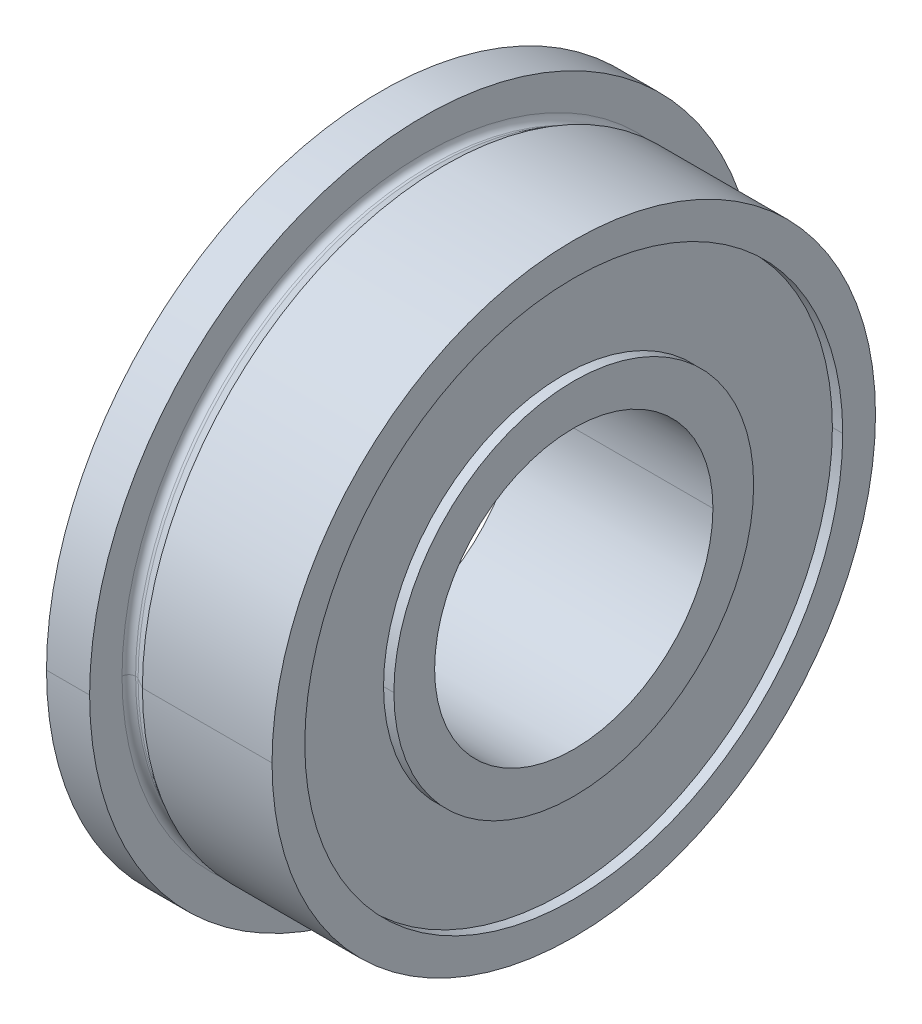
ISO-10303-21;
HEADER;
FILE_DESCRIPTION(('STEP AP214'),'2;1');
FILE_NAME('part.step','',(''),(''),'','','');
FILE_SCHEMA(('AUTOMOTIVE_DESIGN { 1 0 10303 214 1 1 1 1 }'));
ENDSEC;
DATA;
#1=APPLICATION_CONTEXT('core data for automotive mechanical design processes');
#2=APPLICATION_PROTOCOL_DEFINITION('international standard','automotive_design',2000,#1);
#3=PRODUCT_CONTEXT('',#1,'mechanical');
#4=PRODUCT('Part','Part','',(#3));
#5=PRODUCT_RELATED_PRODUCT_CATEGORY('part','',(#4));
#6=PRODUCT_DEFINITION_FORMATION('','',#4);
#7=PRODUCT_DEFINITION_CONTEXT('part definition',#1,'design');
#8=PRODUCT_DEFINITION('design','',#6,#7);
#9=PRODUCT_DEFINITION_SHAPE('','',#8);
#10=(LENGTH_UNIT() NAMED_UNIT(*) SI_UNIT(.MILLI.,.METRE.));
#11=(NAMED_UNIT(*) PLANE_ANGLE_UNIT() SI_UNIT($,.RADIAN.));
#12=(NAMED_UNIT(*) SI_UNIT($,.STERADIAN.) SOLID_ANGLE_UNIT());
#13=UNCERTAINTY_MEASURE_WITH_UNIT(LENGTH_MEASURE(1.E-05),#10,'distance_accuracy_value','');
#14=(GEOMETRIC_REPRESENTATION_CONTEXT(3) GLOBAL_UNCERTAINTY_ASSIGNED_CONTEXT((#13)) GLOBAL_UNIT_ASSIGNED_CONTEXT((#10,
#11,#12)) REPRESENTATION_CONTEXT('',''));
#15=CARTESIAN_POINT('',(0.,0.,0.));
#16=DIRECTION('',(0.,0.,1.));
#17=DIRECTION('',(1.,0.,0.));
#18=AXIS2_PLACEMENT_3D('',#15,#16,#17);
#19=CARTESIAN_POINT('',(0.,0.,0.));
#20=DIRECTION('',(-1.,0.,0.));
#21=DIRECTION('',(0.,0.,1.));
#22=AXIS2_PLACEMENT_3D('',#19,#20,#21);
#23=CYLINDRICAL_SURFACE('',#22,6.625);
#24=DIRECTION('',(-1.,0.,0.));
#25=VECTOR('',#24,1.);
#26=CARTESIAN_POINT('',(0.,0.,-6.625));
#27=LINE('',#26,#25);
#28=CARTESIAN_POINT('',(0.381,0.,-6.625));
#29=VERTEX_POINT('',#28);
#30=CARTESIAN_POINT('',(0.,0.,-6.625));
#31=VERTEX_POINT('',#30);
#32=EDGE_CURVE('E192',#29,#31,#27,.T.);
#33=ORIENTED_EDGE('',*,*,#32,.F.);
#34=CARTESIAN_POINT('',(0.381,0.,0.));
#35=DIRECTION('',(-1.,0.,0.));
#36=DIRECTION('',(0.,0.,1.));
#37=AXIS2_PLACEMENT_3D('',#34,#35,#36);
#38=CIRCLE('',#37,6.625);
#39=CARTESIAN_POINT('',(0.381,0.,6.625));
#40=VERTEX_POINT('',#39);
#41=EDGE_CURVE('E10',#29,#40,#38,.T.);
#42=ORIENTED_EDGE('',*,*,#41,.T.);
#43=DIRECTION('',(-1.,0.,0.));
#44=VECTOR('',#43,1.);
#45=CARTESIAN_POINT('',(0.,0.,6.625));
#46=LINE('',#45,#44);
#47=CARTESIAN_POINT('',(0.,0.,6.625));
#48=VERTEX_POINT('',#47);
#49=EDGE_CURVE('E200',#40,#48,#46,.T.);
#50=ORIENTED_EDGE('',*,*,#49,.T.);
#51=CARTESIAN_POINT('',(0.,0.,0.));
#52=DIRECTION('',(-1.,0.,0.));
#53=DIRECTION('',(0.,0.,1.));
#54=AXIS2_PLACEMENT_3D('',#51,#52,#53);
#55=CIRCLE('',#54,6.625);
#56=EDGE_CURVE('E193',#31,#48,#55,.T.);
#57=ORIENTED_EDGE('',*,*,#56,.F.);
#58=EDGE_LOOP('',(#33,#42,#50,#57));
#59=FACE_BOUND('',#58,.T.);
#60=ADVANCED_FACE('F15',(#59),#23,.T.);
#61=CARTESIAN_POINT('',(0.381,9.906,0.));
#62=DIRECTION('',(1.,0.,0.));
#63=DIRECTION('',(0.,1.,0.));
#64=AXIS2_PLACEMENT_3D('',#61,#62,#63);
#65=PLANE('',#64);
#66=CARTESIAN_POINT('',(0.381,0.,0.));
#67=DIRECTION('',(-1.,0.,0.));
#68=DIRECTION('',(0.,0.,1.));
#69=AXIS2_PLACEMENT_3D('',#66,#67,#68);
#70=CIRCLE('',#69,6.625);
#71=EDGE_CURVE('E187',#40,#29,#70,.T.);
#72=ORIENTED_EDGE('',*,*,#71,.F.);
#73=ORIENTED_EDGE('',*,*,#41,.F.);
#74=EDGE_LOOP('',(#72,#73));
#75=FACE_BOUND('',#74,.T.);
#76=CARTESIAN_POINT('',(0.381,0.,0.));
#77=DIRECTION('',(-1.,0.,0.));
#78=DIRECTION('',(0.,0.,1.));
#79=AXIS2_PLACEMENT_3D('',#76,#77,#78);
#80=CIRCLE('',#79,9.906);
#81=CARTESIAN_POINT('',(0.381,0.,9.906));
#82=VERTEX_POINT('',#81);
#83=CARTESIAN_POINT('',(0.381,0.,-9.906));
#84=VERTEX_POINT('',#83);
#85=EDGE_CURVE('E26',#82,#84,#80,.T.);
#86=ORIENTED_EDGE('',*,*,#85,.T.);
#87=CARTESIAN_POINT('',(0.381,0.,0.));
#88=DIRECTION('',(-1.,0.,0.));
#89=DIRECTION('',(0.,0.,1.));
#90=AXIS2_PLACEMENT_3D('',#87,#88,#89);
#91=CIRCLE('',#90,9.906);
#92=EDGE_CURVE('E251',#84,#82,#91,.T.);
#93=ORIENTED_EDGE('',*,*,#92,.T.);
#94=EDGE_LOOP('',(#86,#93));
#95=FACE_BOUND('',#94,.T.);
#96=ADVANCED_FACE('F184',(#75,#95),#65,.F.);
#97=CARTESIAN_POINT('',(0.,0.,0.));
#98=DIRECTION('',(-1.,0.,0.));
#99=DIRECTION('',(0.,0.,1.));
#100=AXIS2_PLACEMENT_3D('',#97,#98,#99);
#101=CYLINDRICAL_SURFACE('',#100,9.906);
#102=DIRECTION('',(-1.,0.,0.));
#103=VECTOR('',#102,1.);
#104=CARTESIAN_POINT('',(0.,0.,-9.906));
#105=LINE('',#104,#103);
#106=CARTESIAN_POINT('',(0.,0.,-9.906));
#107=VERTEX_POINT('',#106);
#108=EDGE_CURVE('E247',#84,#107,#105,.T.);
#109=ORIENTED_EDGE('',*,*,#108,.F.);
#110=ORIENTED_EDGE('',*,*,#85,.F.);
#111=DIRECTION('',(-1.,0.,0.));
#112=VECTOR('',#111,1.);
#113=CARTESIAN_POINT('',(0.,0.,9.906));
#114=LINE('',#113,#112);
#115=CARTESIAN_POINT('',(0.,0.,9.906));
#116=VERTEX_POINT('',#115);
#117=EDGE_CURVE('E233',#82,#116,#114,.T.);
#118=ORIENTED_EDGE('',*,*,#117,.T.);
#119=CARTESIAN_POINT('',(0.,0.,0.));
#120=DIRECTION('',(-1.,0.,0.));
#121=DIRECTION('',(0.,0.,1.));
#122=AXIS2_PLACEMENT_3D('',#119,#120,#121);
#123=CIRCLE('',#122,9.906);
#124=EDGE_CURVE('E224',#116,#107,#123,.T.);
#125=ORIENTED_EDGE('',*,*,#124,.T.);
#126=EDGE_LOOP('',(#109,#110,#118,#125));
#127=FACE_BOUND('',#126,.T.);
#128=ADVANCED_FACE('F439',(#127),#101,.F.);
#129=CARTESIAN_POINT('',(0.,12.3063,0.));
#130=DIRECTION('',(1.,0.,0.));
#131=DIRECTION('',(0.,1.,0.));
#132=AXIS2_PLACEMENT_3D('',#129,#130,#131);
#133=PLANE('',#132);
#134=ORIENTED_EDGE('',*,*,#124,.F.);
#135=CARTESIAN_POINT('',(0.,0.,0.));
#136=DIRECTION('',(-1.,0.,0.));
#137=DIRECTION('',(0.,0.,1.));
#138=AXIS2_PLACEMENT_3D('',#135,#136,#137);
#139=CIRCLE('',#138,9.906);
#140=EDGE_CURVE('E246',#107,#116,#139,.T.);
#141=ORIENTED_EDGE('',*,*,#140,.F.);
#142=EDGE_LOOP('',(#134,#141));
#143=FACE_BOUND('',#142,.T.);
#144=CARTESIAN_POINT('',(0.,0.,0.));
#145=DIRECTION('',(-1.,0.,0.));
#146=DIRECTION('',(0.,0.,1.));
#147=AXIS2_PLACEMENT_3D('',#144,#145,#146);
#148=CIRCLE('',#147,12.3063);
#149=CARTESIAN_POINT('',(0.,0.,12.3063));
#150=VERTEX_POINT('',#149);
#151=CARTESIAN_POINT('',(0.,0.,-12.3063));
#152=VERTEX_POINT('',#151);
#153=EDGE_CURVE('E234',#150,#152,#148,.T.);
#154=ORIENTED_EDGE('',*,*,#153,.T.);
#155=CARTESIAN_POINT('',(0.,0.,0.));
#156=DIRECTION('',(-1.,0.,0.));
#157=DIRECTION('',(0.,0.,1.));
#158=AXIS2_PLACEMENT_3D('',#155,#156,#157);
#159=CIRCLE('',#158,12.3063);
#160=EDGE_CURVE('E227',#152,#150,#159,.T.);
#161=ORIENTED_EDGE('',*,*,#160,.T.);
#162=EDGE_LOOP('',(#154,#161));
#163=FACE_BOUND('',#162,.T.);
#164=ADVANCED_FACE('F487',(#143,#163),#133,.F.);
#165=CARTESIAN_POINT('',(0.,0.,0.));
#166=DIRECTION('',(-1.,0.,0.));
#167=DIRECTION('',(0.,0.,1.));
#168=AXIS2_PLACEMENT_3D('',#165,#166,#167);
#169=CYLINDRICAL_SURFACE('',#168,12.3063);
#170=DIRECTION('',(-1.,0.,0.));
#171=VECTOR('',#170,1.);
#172=CARTESIAN_POINT('',(0.,0.,-12.3063));
#173=LINE('',#172,#171);
#174=CARTESIAN_POINT('',(1.5875,0.,-12.3063));
#175=VERTEX_POINT('',#174);
#176=EDGE_CURVE('E232',#175,#152,#173,.T.);
#177=ORIENTED_EDGE('',*,*,#176,.F.);
#178=CARTESIAN_POINT('',(1.5875,0.,0.));
#179=DIRECTION('',(-1.,0.,0.));
#180=DIRECTION('',(0.,0.,1.));
#181=AXIS2_PLACEMENT_3D('',#178,#179,#180);
#182=CIRCLE('',#181,12.3063);
#183=CARTESIAN_POINT('',(1.5875,0.,12.3063));
#184=VERTEX_POINT('',#183);
#185=EDGE_CURVE('E272',#175,#184,#182,.T.);
#186=ORIENTED_EDGE('',*,*,#185,.T.);
#187=DIRECTION('',(-1.,0.,0.));
#188=VECTOR('',#187,1.);
#189=CARTESIAN_POINT('',(0.,0.,12.3063));
#190=LINE('',#189,#188);
#191=EDGE_CURVE('E237',#184,#150,#190,.T.);
#192=ORIENTED_EDGE('',*,*,#191,.T.);
#193=ORIENTED_EDGE('',*,*,#160,.F.);
#194=EDGE_LOOP('',(#177,#186,#192,#193));
#195=FACE_BOUND('',#194,.T.);
#196=ADVANCED_FACE('F384',(#195),#169,.T.);
#197=CARTESIAN_POINT('',(1.5875,11.1125,0.));
#198=DIRECTION('',(-1.,0.,0.));
#199=DIRECTION('',(0.,0.,1.));
#200=AXIS2_PLACEMENT_3D('',#197,#198,#199);
#201=PLANE('',#200);
#202=CARTESIAN_POINT('',(1.5875,0.,0.));
#203=DIRECTION('',(-1.,0.,0.));
#204=DIRECTION('',(0.,0.,1.));
#205=AXIS2_PLACEMENT_3D('',#202,#203,#204);
#206=CIRCLE('',#205,11.1125);
#207=CARTESIAN_POINT('',(1.5875,0.,11.1125));
#208=VERTEX_POINT('',#207);
#209=CARTESIAN_POINT('',(1.5875,0.,-11.1125));
#210=VERTEX_POINT('',#209);
#211=EDGE_CURVE('E278',#208,#210,#206,.T.);
#212=ORIENTED_EDGE('',*,*,#211,.T.);
#213=CARTESIAN_POINT('',(1.5875,0.,0.));
#214=DIRECTION('',(-1.,0.,0.));
#215=DIRECTION('',(0.,0.,1.));
#216=AXIS2_PLACEMENT_3D('',#213,#214,#215);
#217=CIRCLE('',#216,11.1125);
#218=EDGE_CURVE('E148',#210,#208,#217,.T.);
#219=ORIENTED_EDGE('',*,*,#218,.T.);
#220=EDGE_LOOP('',(#212,#219));
#221=FACE_BOUND('',#220,.T.);
#222=CARTESIAN_POINT('',(1.5875,0.,0.));
#223=DIRECTION('',(-1.,0.,0.));
#224=DIRECTION('',(0.,0.,1.));
#225=AXIS2_PLACEMENT_3D('',#222,#223,#224);
#226=CIRCLE('',#225,12.3063);
#227=EDGE_CURVE('E228',#184,#175,#226,.T.);
#228=ORIENTED_EDGE('',*,*,#227,.F.);
#229=ORIENTED_EDGE('',*,*,#185,.F.);
#230=EDGE_LOOP('',(#228,#229));
#231=FACE_BOUND('',#230,.T.);
#232=ADVANCED_FACE('F381',(#221,#231),#201,.F.);
#233=CARTESIAN_POINT('',(1.8375,0.,0.));
#234=DIRECTION('',(-1.,0.,0.));
#235=DIRECTION('',(0.,0.,1.));
#236=AXIS2_PLACEMENT_3D('',#233,#234,#235);
#237=TOROIDAL_SURFACE('',#236,11.1125,0.25);
#238=CARTESIAN_POINT('',(1.8375,0.,0.));
#239=DIRECTION('',(-1.,0.,0.));
#240=DIRECTION('',(0.,0.,1.));
#241=AXIS2_PLACEMENT_3D('',#238,#239,#240);
#242=CIRCLE('',#241,10.8625);
#243=CARTESIAN_POINT('',(1.8375,0.,10.8625));
#244=VERTEX_POINT('',#243);
#245=CARTESIAN_POINT('',(1.8375,0.,-10.8625));
#246=VERTEX_POINT('',#245);
#247=EDGE_CURVE('E279',#244,#246,#242,.T.);
#248=ORIENTED_EDGE('',*,*,#247,.F.);
#249=CARTESIAN_POINT('',(1.8375,0.,11.1125));
#250=DIRECTION('',(0.,-1.,0.));
#251=DIRECTION('',(0.,0.,-1.));
#252=AXIS2_PLACEMENT_3D('',#249,#250,#251);
#253=CIRCLE('',#252,0.25);
#254=CARTESIAN_POINT('',(1.9625,0.,10.8959936490539));
#255=VERTEX_POINT('',#254);
#256=EDGE_CURVE('E138',#244,#255,#253,.T.);
#257=ORIENTED_EDGE('',*,*,#256,.T.);
#258=CARTESIAN_POINT('',(1.9625,0.,0.));
#259=DIRECTION('',(-1.,0.,0.));
#260=DIRECTION('',(0.,0.,1.));
#261=AXIS2_PLACEMENT_3D('',#258,#259,#260);
#262=CIRCLE('',#261,10.8959936490539);
#263=CARTESIAN_POINT('',(1.9625,0.,-10.8959936490539));
#264=VERTEX_POINT('',#263);
#265=EDGE_CURVE('E252',#255,#264,#262,.T.);
#266=ORIENTED_EDGE('',*,*,#265,.T.);
#267=CARTESIAN_POINT('',(1.8375,0.,-11.1125));
#268=DIRECTION('',(0.,1.,0.));
#269=DIRECTION('',(0.,0.,1.));
#270=AXIS2_PLACEMENT_3D('',#267,#268,#269);
#271=CIRCLE('',#270,0.25);
#272=EDGE_CURVE('E305',#246,#264,#271,.T.);
#273=ORIENTED_EDGE('',*,*,#272,.F.);
#274=EDGE_LOOP('',(#248,#257,#266,#273));
#275=FACE_BOUND('',#274,.T.);
#276=ADVANCED_FACE('F377',(#275),#237,.F.);
#277=CARTESIAN_POINT('',(2.3375,0.,0.));
#278=DIRECTION('',(1.,0.,0.));
#279=DIRECTION('',(0.,0.,-1.));
#280=AXIS2_PLACEMENT_3D('',#277,#278,#279);
#281=CONICAL_SURFACE('',#280,11.1125,0.523598775598299);
#282=DIRECTION('',(0.866025403784438,0.,0.5));
#283=VECTOR('',#282,1.);
#284=CARTESIAN_POINT('',(2.3375,0.,11.1125));
#285=LINE('',#284,#283);
#286=CARTESIAN_POINT('',(2.3375,0.,11.1125));
#287=VERTEX_POINT('',#286);
#288=EDGE_CURVE('E256',#255,#287,#285,.T.);
#289=ORIENTED_EDGE('',*,*,#288,.F.);
#290=CARTESIAN_POINT('',(1.9625,0.,0.));
#291=DIRECTION('',(-1.,0.,0.));
#292=DIRECTION('',(0.,0.,1.));
#293=AXIS2_PLACEMENT_3D('',#290,#291,#292);
#294=CIRCLE('',#293,10.8959936490539);
#295=EDGE_CURVE('E309',#264,#255,#294,.T.);
#296=ORIENTED_EDGE('',*,*,#295,.F.);
#297=DIRECTION('',(0.866025403784438,0.,-0.5));
#298=VECTOR('',#297,1.);
#299=CARTESIAN_POINT('',(2.3375,0.,-11.1125));
#300=LINE('',#299,#298);
#301=CARTESIAN_POINT('',(2.3375,0.,-11.1125));
#302=VERTEX_POINT('',#301);
#303=EDGE_CURVE('E319',#264,#302,#300,.T.);
#304=ORIENTED_EDGE('',*,*,#303,.T.);
#305=CARTESIAN_POINT('',(2.3375,0.,0.));
#306=DIRECTION('',(-1.,0.,0.));
#307=DIRECTION('',(0.,0.,1.));
#308=AXIS2_PLACEMENT_3D('',#305,#306,#307);
#309=CIRCLE('',#308,11.1125);
#310=EDGE_CURVE('E340',#302,#287,#309,.T.);
#311=ORIENTED_EDGE('',*,*,#310,.T.);
#312=EDGE_LOOP('',(#289,#296,#304,#311));
#313=FACE_BOUND('',#312,.T.);
#314=ADVANCED_FACE('F371',(#313),#281,.T.);
#315=CARTESIAN_POINT('',(0.,0.,0.));
#316=DIRECTION('',(-1.,0.,0.));
#317=DIRECTION('',(0.,0.,1.));
#318=AXIS2_PLACEMENT_3D('',#315,#316,#317);
#319=CYLINDRICAL_SURFACE('',#318,11.1125);
#320=DIRECTION('',(-1.,0.,0.));
#321=VECTOR('',#320,1.);
#322=CARTESIAN_POINT('',(0.,0.,-11.1125));
#323=LINE('',#322,#321);
#324=CARTESIAN_POINT('',(7.112,0.,-11.1125));
#325=VERTEX_POINT('',#324);
#326=EDGE_CURVE('E327',#325,#302,#323,.T.);
#327=ORIENTED_EDGE('',*,*,#326,.F.);
#328=CARTESIAN_POINT('',(7.112,0.,0.));
#329=DIRECTION('',(-1.,0.,0.));
#330=DIRECTION('',(0.,0.,1.));
#331=AXIS2_PLACEMENT_3D('',#328,#329,#330);
#332=CIRCLE('',#331,11.1125);
#333=CARTESIAN_POINT('',(7.112,0.,11.1125));
#334=VERTEX_POINT('',#333);
#335=EDGE_CURVE('E354',#325,#334,#332,.T.);
#336=ORIENTED_EDGE('',*,*,#335,.T.);
#337=DIRECTION('',(-1.,0.,0.));
#338=VECTOR('',#337,1.);
#339=CARTESIAN_POINT('',(0.,0.,11.1125));
#340=LINE('',#339,#338);
#341=EDGE_CURVE('E303',#334,#287,#340,.T.);
#342=ORIENTED_EDGE('',*,*,#341,.T.);
#343=ORIENTED_EDGE('',*,*,#310,.F.);
#344=EDGE_LOOP('',(#327,#336,#342,#343));
#345=FACE_BOUND('',#344,.T.);
#346=ADVANCED_FACE('F470',(#345),#319,.T.);
#347=CARTESIAN_POINT('',(7.112,9.906,0.));
#348=DIRECTION('',(-1.,0.,0.));
#349=DIRECTION('',(0.,0.,1.));
#350=AXIS2_PLACEMENT_3D('',#347,#348,#349);
#351=PLANE('',#350);
#352=CARTESIAN_POINT('',(7.112,0.,0.));
#353=DIRECTION('',(-1.,0.,0.));
#354=DIRECTION('',(0.,0.,1.));
#355=AXIS2_PLACEMENT_3D('',#352,#353,#354);
#356=CIRCLE('',#355,9.906);
#357=CARTESIAN_POINT('',(7.112,0.,9.906));
#358=VERTEX_POINT('',#357);
#359=CARTESIAN_POINT('',(7.112,0.,-9.906));
#360=VERTEX_POINT('',#359);
#361=EDGE_CURVE('E222',#358,#360,#356,.T.);
#362=ORIENTED_EDGE('',*,*,#361,.T.);
#363=CARTESIAN_POINT('',(7.112,0.,0.));
#364=DIRECTION('',(-1.,0.,0.));
#365=DIRECTION('',(0.,0.,1.));
#366=AXIS2_PLACEMENT_3D('',#363,#364,#365);
#367=CIRCLE('',#366,9.906);
#368=EDGE_CURVE('E218',#360,#358,#367,.T.);
#369=ORIENTED_EDGE('',*,*,#368,.T.);
#370=EDGE_LOOP('',(#362,#369));
#371=FACE_BOUND('',#370,.T.);
#372=CARTESIAN_POINT('',(7.112,0.,0.));
#373=DIRECTION('',(-1.,0.,0.));
#374=DIRECTION('',(0.,0.,1.));
#375=AXIS2_PLACEMENT_3D('',#372,#373,#374);
#376=CIRCLE('',#375,11.1125);
#377=EDGE_CURVE('E331',#334,#325,#376,.T.);
#378=ORIENTED_EDGE('',*,*,#377,.F.);
#379=ORIENTED_EDGE('',*,*,#335,.F.);
#380=EDGE_LOOP('',(#378,#379));
#381=FACE_BOUND('',#380,.T.);
#382=ADVANCED_FACE('F451',(#371,#381),#351,.F.);
#383=CARTESIAN_POINT('',(0.,0.,0.));
#384=DIRECTION('',(-1.,0.,0.));
#385=DIRECTION('',(0.,0.,1.));
#386=AXIS2_PLACEMENT_3D('',#383,#384,#385);
#387=CYLINDRICAL_SURFACE('',#386,9.906);
#388=DIRECTION('',(-1.,0.,0.));
#389=VECTOR('',#388,1.);
#390=CARTESIAN_POINT('',(0.,0.,-9.906));
#391=LINE('',#390,#389);
#392=CARTESIAN_POINT('',(6.731,0.,-9.906));
#393=VERTEX_POINT('',#392);
#394=EDGE_CURVE('E213',#360,#393,#391,.T.);
#395=ORIENTED_EDGE('',*,*,#394,.F.);
#396=ORIENTED_EDGE('',*,*,#361,.F.);
#397=DIRECTION('',(-1.,0.,0.));
#398=VECTOR('',#397,1.);
#399=CARTESIAN_POINT('',(0.,0.,9.906));
#400=LINE('',#399,#398);
#401=CARTESIAN_POINT('',(6.731,0.,9.906));
#402=VERTEX_POINT('',#401);
#403=EDGE_CURVE('E242',#358,#402,#400,.T.);
#404=ORIENTED_EDGE('',*,*,#403,.T.);
#405=CARTESIAN_POINT('',(6.731,0.,0.));
#406=DIRECTION('',(-1.,0.,0.));
#407=DIRECTION('',(0.,0.,1.));
#408=AXIS2_PLACEMENT_3D('',#405,#406,#407);
#409=CIRCLE('',#408,9.906);
#410=EDGE_CURVE('E219',#402,#393,#409,.T.);
#411=ORIENTED_EDGE('',*,*,#410,.T.);
#412=EDGE_LOOP('',(#395,#396,#404,#411));
#413=FACE_BOUND('',#412,.T.);
#414=ADVANCED_FACE('F449',(#413),#387,.F.);
#415=CARTESIAN_POINT('',(6.731,9.906,0.));
#416=DIRECTION('',(-1.,0.,0.));
#417=DIRECTION('',(0.,0.,1.));
#418=AXIS2_PLACEMENT_3D('',#415,#416,#417);
#419=PLANE('',#418);
#420=CARTESIAN_POINT('',(6.731,0.,0.));
#421=DIRECTION('',(-1.,0.,0.));
#422=DIRECTION('',(0.,0.,1.));
#423=AXIS2_PLACEMENT_3D('',#420,#421,#422);
#424=CIRCLE('',#423,6.625);
#425=CARTESIAN_POINT('',(6.731,0.,6.625));
#426=VERTEX_POINT('',#425);
#427=CARTESIAN_POINT('',(6.731,0.,-6.625));
#428=VERTEX_POINT('',#427);
#429=EDGE_CURVE('E314',#426,#428,#424,.T.);
#430=ORIENTED_EDGE('',*,*,#429,.T.);
#431=CARTESIAN_POINT('',(6.731,0.,0.));
#432=DIRECTION('',(-1.,0.,0.));
#433=DIRECTION('',(0.,0.,1.));
#434=AXIS2_PLACEMENT_3D('',#431,#432,#433);
#435=CIRCLE('',#434,6.625);
#436=EDGE_CURVE('E223',#428,#426,#435,.T.);
#437=ORIENTED_EDGE('',*,*,#436,.T.);
#438=EDGE_LOOP('',(#430,#437));
#439=FACE_BOUND('',#438,.T.);
#440=ORIENTED_EDGE('',*,*,#410,.F.);
#441=CARTESIAN_POINT('',(6.731,0.,0.));
#442=DIRECTION('',(-1.,0.,0.));
#443=DIRECTION('',(0.,0.,1.));
#444=AXIS2_PLACEMENT_3D('',#441,#442,#443);
#445=CIRCLE('',#444,9.906);
#446=EDGE_CURVE('E217',#393,#402,#445,.T.);
#447=ORIENTED_EDGE('',*,*,#446,.F.);
#448=EDGE_LOOP('',(#440,#447));
#449=FACE_BOUND('',#448,.T.);
#450=ADVANCED_FACE('F412',(#439,#449),#419,.F.);
#451=CARTESIAN_POINT('',(0.,0.,0.));
#452=DIRECTION('',(-1.,0.,0.));
#453=DIRECTION('',(0.,0.,1.));
#454=AXIS2_PLACEMENT_3D('',#451,#452,#453);
#455=CYLINDRICAL_SURFACE('',#454,6.625);
#456=DIRECTION('',(-1.,0.,0.));
#457=VECTOR('',#456,1.);
#458=CARTESIAN_POINT('',(0.,0.,-6.625));
#459=LINE('',#458,#457);
#460=CARTESIAN_POINT('',(7.112,0.,-6.625));
#461=VERTEX_POINT('',#460);
#462=EDGE_CURVE('E310',#461,#428,#459,.T.);
#463=ORIENTED_EDGE('',*,*,#462,.F.);
#464=CARTESIAN_POINT('',(7.112,0.,0.));
#465=DIRECTION('',(-1.,0.,0.));
#466=DIRECTION('',(0.,0.,1.));
#467=AXIS2_PLACEMENT_3D('',#464,#465,#466);
#468=CIRCLE('',#467,6.625);
#469=CARTESIAN_POINT('',(7.112,0.,6.625));
#470=VERTEX_POINT('',#469);
#471=EDGE_CURVE('E267',#461,#470,#468,.T.);
#472=ORIENTED_EDGE('',*,*,#471,.T.);
#473=DIRECTION('',(-1.,0.,0.));
#474=VECTOR('',#473,1.);
#475=CARTESIAN_POINT('',(0.,0.,6.625));
#476=LINE('',#475,#474);
#477=EDGE_CURVE('E320',#470,#426,#476,.T.);
#478=ORIENTED_EDGE('',*,*,#477,.T.);
#479=ORIENTED_EDGE('',*,*,#436,.F.);
#480=EDGE_LOOP('',(#463,#472,#478,#479));
#481=FACE_BOUND('',#480,.T.);
#482=ADVANCED_FACE('F420',(#481),#455,.T.);
#483=CARTESIAN_POINT('',(7.112,5.125,0.));
#484=DIRECTION('',(-1.,0.,0.));
#485=DIRECTION('',(0.,0.,1.));
#486=AXIS2_PLACEMENT_3D('',#483,#484,#485);
#487=PLANE('',#486);
#488=CARTESIAN_POINT('',(7.112,0.,0.));
#489=DIRECTION('',(-1.,0.,0.));
#490=DIRECTION('',(0.,0.,1.));
#491=AXIS2_PLACEMENT_3D('',#488,#489,#490);
#492=CIRCLE('',#491,5.125);
#493=CARTESIAN_POINT('',(7.112,0.,5.125));
#494=VERTEX_POINT('',#493);
#495=CARTESIAN_POINT('',(7.112,0.,-5.125));
#496=VERTEX_POINT('',#495);
#497=EDGE_CURVE('E259',#494,#496,#492,.T.);
#498=ORIENTED_EDGE('',*,*,#497,.T.);
#499=CARTESIAN_POINT('',(7.112,0.,0.));
#500=DIRECTION('',(-1.,0.,0.));
#501=DIRECTION('',(0.,0.,1.));
#502=AXIS2_PLACEMENT_3D('',#499,#500,#501);
#503=CIRCLE('',#502,5.125);
#504=EDGE_CURVE('E324',#496,#494,#503,.T.);
#505=ORIENTED_EDGE('',*,*,#504,.T.);
#506=EDGE_LOOP('',(#498,#505));
#507=FACE_BOUND('',#506,.T.);
#508=CARTESIAN_POINT('',(7.112,0.,0.));
#509=DIRECTION('',(-1.,0.,0.));
#510=DIRECTION('',(0.,0.,1.));
#511=AXIS2_PLACEMENT_3D('',#508,#509,#510);
#512=CIRCLE('',#511,6.625);
#513=EDGE_CURVE('E315',#470,#461,#512,.T.);
#514=ORIENTED_EDGE('',*,*,#513,.F.);
#515=ORIENTED_EDGE('',*,*,#471,.F.);
#516=EDGE_LOOP('',(#514,#515));
#517=FACE_BOUND('',#516,.T.);
#518=ADVANCED_FACE('F17',(#507,#517),#487,.F.);
#519=CARTESIAN_POINT('',(0.,0.,0.));
#520=DIRECTION('',(-1.,0.,0.));
#521=DIRECTION('',(0.,0.,1.));
#522=AXIS2_PLACEMENT_3D('',#519,#520,#521);
#523=CYLINDRICAL_SURFACE('',#522,5.125);
#524=DIRECTION('',(-1.,0.,0.));
#525=VECTOR('',#524,1.);
#526=CARTESIAN_POINT('',(0.,0.,-5.125));
#527=LINE('',#526,#525);
#528=CARTESIAN_POINT('',(0.,0.,-5.125));
#529=VERTEX_POINT('',#528);
#530=EDGE_CURVE('E299',#496,#529,#527,.T.);
#531=ORIENTED_EDGE('',*,*,#530,.F.);
#532=ORIENTED_EDGE('',*,*,#497,.F.);
#533=DIRECTION('',(-1.,0.,0.));
#534=VECTOR('',#533,1.);
#535=CARTESIAN_POINT('',(0.,0.,5.125));
#536=LINE('',#535,#534);
#537=CARTESIAN_POINT('',(0.,0.,5.125));
#538=VERTEX_POINT('',#537);
#539=EDGE_CURVE('E274',#494,#538,#536,.T.);
#540=ORIENTED_EDGE('',*,*,#539,.T.);
#541=CARTESIAN_POINT('',(0.,0.,0.));
#542=DIRECTION('',(-1.,0.,0.));
#543=DIRECTION('',(0.,0.,1.));
#544=AXIS2_PLACEMENT_3D('',#541,#542,#543);
#545=CIRCLE('',#544,5.125);
#546=EDGE_CURVE('E40',#538,#529,#545,.T.);
#547=ORIENTED_EDGE('',*,*,#546,.T.);
#548=EDGE_LOOP('',(#531,#532,#540,#547));
#549=FACE_BOUND('',#548,.T.);
#550=ADVANCED_FACE('F423',(#549),#523,.F.);
#551=CARTESIAN_POINT('',(0.,6.625,0.));
#552=DIRECTION('',(1.,0.,0.));
#553=DIRECTION('',(0.,1.,0.));
#554=AXIS2_PLACEMENT_3D('',#551,#552,#553);
#555=PLANE('',#554);
#556=ORIENTED_EDGE('',*,*,#546,.F.);
#557=CARTESIAN_POINT('',(0.,0.,0.));
#558=DIRECTION('',(-1.,0.,0.));
#559=DIRECTION('',(0.,0.,1.));
#560=AXIS2_PLACEMENT_3D('',#557,#558,#559);
#561=CIRCLE('',#560,5.125);
#562=EDGE_CURVE('E211',#529,#538,#561,.T.);
#563=ORIENTED_EDGE('',*,*,#562,.F.);
#564=EDGE_LOOP('',(#556,#563));
#565=FACE_BOUND('',#564,.T.);
#566=CARTESIAN_POINT('',(0.,0.,0.));
#567=DIRECTION('',(-1.,0.,0.));
#568=DIRECTION('',(0.,0.,1.));
#569=AXIS2_PLACEMENT_3D('',#566,#567,#568);
#570=CIRCLE('',#569,6.625);
#571=EDGE_CURVE('E19',#48,#31,#570,.T.);
#572=ORIENTED_EDGE('',*,*,#571,.T.);
#573=ORIENTED_EDGE('',*,*,#56,.T.);
#574=EDGE_LOOP('',(#572,#573));
#575=FACE_BOUND('',#574,.T.);
#576=ADVANCED_FACE('F430',(#565,#575),#555,.F.);
#577=CARTESIAN_POINT('',(0.,0.,0.));
#578=DIRECTION('',(-1.,0.,0.));
#579=DIRECTION('',(0.,0.,1.));
#580=AXIS2_PLACEMENT_3D('',#577,#578,#579);
#581=CYLINDRICAL_SURFACE('',#580,5.125);
#582=ORIENTED_EDGE('',*,*,#504,.F.);
#583=ORIENTED_EDGE('',*,*,#530,.T.);
#584=ORIENTED_EDGE('',*,*,#562,.T.);
#585=ORIENTED_EDGE('',*,*,#539,.F.);
#586=EDGE_LOOP('',(#582,#583,#584,#585));
#587=FACE_BOUND('',#586,.T.);
#588=ADVANCED_FACE('F448',(#587),#581,.F.);
#589=CARTESIAN_POINT('',(0.,0.,0.));
#590=DIRECTION('',(-1.,0.,0.));
#591=DIRECTION('',(0.,0.,1.));
#592=AXIS2_PLACEMENT_3D('',#589,#590,#591);
#593=CYLINDRICAL_SURFACE('',#592,6.625);
#594=ORIENTED_EDGE('',*,*,#513,.T.);
#595=ORIENTED_EDGE('',*,*,#462,.T.);
#596=ORIENTED_EDGE('',*,*,#429,.F.);
#597=ORIENTED_EDGE('',*,*,#477,.F.);
#598=EDGE_LOOP('',(#594,#595,#596,#597));
#599=FACE_BOUND('',#598,.T.);
#600=ADVANCED_FACE('F417',(#599),#593,.T.);
#601=CARTESIAN_POINT('',(0.,0.,0.));
#602=DIRECTION('',(-1.,0.,0.));
#603=DIRECTION('',(0.,0.,1.));
#604=AXIS2_PLACEMENT_3D('',#601,#602,#603);
#605=CYLINDRICAL_SURFACE('',#604,9.906);
#606=ORIENTED_EDGE('',*,*,#368,.F.);
#607=ORIENTED_EDGE('',*,*,#394,.T.);
#608=ORIENTED_EDGE('',*,*,#446,.T.);
#609=ORIENTED_EDGE('',*,*,#403,.F.);
#610=EDGE_LOOP('',(#606,#607,#608,#609));
#611=FACE_BOUND('',#610,.T.);
#612=ADVANCED_FACE('F455',(#611),#605,.F.);
#613=CARTESIAN_POINT('',(0.,0.,0.));
#614=DIRECTION('',(-1.,0.,0.));
#615=DIRECTION('',(0.,0.,1.));
#616=AXIS2_PLACEMENT_3D('',#613,#614,#615);
#617=CYLINDRICAL_SURFACE('',#616,11.1125);
#618=ORIENTED_EDGE('',*,*,#377,.T.);
#619=ORIENTED_EDGE('',*,*,#326,.T.);
#620=CARTESIAN_POINT('',(2.3375,0.,0.));
#621=DIRECTION('',(-1.,0.,0.));
#622=DIRECTION('',(0.,0.,1.));
#623=AXIS2_PLACEMENT_3D('',#620,#621,#622);
#624=CIRCLE('',#623,11.1125);
#625=EDGE_CURVE('E263',#287,#302,#624,.T.);
#626=ORIENTED_EDGE('',*,*,#625,.F.);
#627=ORIENTED_EDGE('',*,*,#341,.F.);
#628=EDGE_LOOP('',(#618,#619,#626,#627));
#629=FACE_BOUND('',#628,.T.);
#630=ADVANCED_FACE('F453',(#629),#617,.T.);
#631=CARTESIAN_POINT('',(2.3375,0.,0.));
#632=DIRECTION('',(1.,0.,0.));
#633=DIRECTION('',(0.,0.,-1.));
#634=AXIS2_PLACEMENT_3D('',#631,#632,#633);
#635=CONICAL_SURFACE('',#634,11.1125,0.523598775598299);
#636=ORIENTED_EDGE('',*,*,#265,.F.);
#637=ORIENTED_EDGE('',*,*,#288,.T.);
#638=ORIENTED_EDGE('',*,*,#625,.T.);
#639=ORIENTED_EDGE('',*,*,#303,.F.);
#640=EDGE_LOOP('',(#636,#637,#638,#639));
#641=FACE_BOUND('',#640,.T.);
#642=ADVANCED_FACE('F375',(#641),#635,.T.);
#643=CARTESIAN_POINT('',(1.8375,0.,0.));
#644=DIRECTION('',(-1.,0.,0.));
#645=DIRECTION('',(0.,0.,1.));
#646=AXIS2_PLACEMENT_3D('',#643,#644,#645);
#647=TOROIDAL_SURFACE('',#646,11.1125,0.25);
#648=CARTESIAN_POINT('',(1.8375,0.,0.));
#649=DIRECTION('',(-1.,0.,0.));
#650=DIRECTION('',(0.,0.,1.));
#651=AXIS2_PLACEMENT_3D('',#648,#649,#650);
#652=CIRCLE('',#651,10.8625);
#653=EDGE_CURVE('E207',#246,#244,#652,.T.);
#654=ORIENTED_EDGE('',*,*,#653,.F.);
#655=ORIENTED_EDGE('',*,*,#272,.T.);
#656=ORIENTED_EDGE('',*,*,#295,.T.);
#657=ORIENTED_EDGE('',*,*,#256,.F.);
#658=EDGE_LOOP('',(#654,#655,#656,#657));
#659=FACE_BOUND('',#658,.T.);
#660=ADVANCED_FACE('F369',(#659),#647,.F.);
#661=CARTESIAN_POINT('',(0.,0.,0.));
#662=DIRECTION('',(-1.,0.,0.));
#663=DIRECTION('',(0.,0.,1.));
#664=AXIS2_PLACEMENT_3D('',#661,#662,#663);
#665=CYLINDRICAL_SURFACE('',#664,12.3063);
#666=ORIENTED_EDGE('',*,*,#227,.T.);
#667=ORIENTED_EDGE('',*,*,#176,.T.);
#668=ORIENTED_EDGE('',*,*,#153,.F.);
#669=ORIENTED_EDGE('',*,*,#191,.F.);
#670=EDGE_LOOP('',(#666,#667,#668,#669));
#671=FACE_BOUND('',#670,.T.);
#672=ADVANCED_FACE('F390',(#671),#665,.T.);
#673=CARTESIAN_POINT('',(0.,0.,0.));
#674=DIRECTION('',(-1.,0.,0.));
#675=DIRECTION('',(0.,0.,1.));
#676=AXIS2_PLACEMENT_3D('',#673,#674,#675);
#677=CYLINDRICAL_SURFACE('',#676,9.906);
#678=ORIENTED_EDGE('',*,*,#92,.F.);
#679=ORIENTED_EDGE('',*,*,#108,.T.);
#680=ORIENTED_EDGE('',*,*,#140,.T.);
#681=ORIENTED_EDGE('',*,*,#117,.F.);
#682=EDGE_LOOP('',(#678,#679,#680,#681));
#683=FACE_BOUND('',#682,.T.);
#684=ADVANCED_FACE('F492',(#683),#677,.F.);
#685=CARTESIAN_POINT('',(0.,0.,0.));
#686=DIRECTION('',(-1.,0.,0.));
#687=DIRECTION('',(0.,0.,1.));
#688=AXIS2_PLACEMENT_3D('',#685,#686,#687);
#689=CYLINDRICAL_SURFACE('',#688,6.625);
#690=ORIENTED_EDGE('',*,*,#71,.T.);
#691=ORIENTED_EDGE('',*,*,#32,.T.);
#692=ORIENTED_EDGE('',*,*,#571,.F.);
#693=ORIENTED_EDGE('',*,*,#49,.F.);
#694=EDGE_LOOP('',(#690,#691,#692,#693));
#695=FACE_BOUND('',#694,.T.);
#696=ADVANCED_FACE('F199',(#695),#689,.T.);
#697=CARTESIAN_POINT('',(1.8375,0.,0.));
#698=DIRECTION('',(-1.,0.,0.));
#699=DIRECTION('',(0.,0.,1.));
#700=AXIS2_PLACEMENT_3D('',#697,#698,#699);
#701=TOROIDAL_SURFACE('',#700,11.1125,0.25);
#702=CARTESIAN_POINT('',(1.8375,0.,-11.1125));
#703=DIRECTION('',(0.,1.,0.));
#704=DIRECTION('',(0.,0.,1.));
#705=AXIS2_PLACEMENT_3D('',#702,#703,#704);
#706=CIRCLE('',#705,0.25);
#707=EDGE_CURVE('E275',#210,#246,#706,.T.);
#708=ORIENTED_EDGE('',*,*,#707,.T.);
#709=ORIENTED_EDGE('',*,*,#653,.T.);
#710=CARTESIAN_POINT('',(1.8375,0.,11.1125));
#711=DIRECTION('',(0.,-1.,0.));
#712=DIRECTION('',(0.,0.,-1.));
#713=AXIS2_PLACEMENT_3D('',#710,#711,#712);
#714=CIRCLE('',#713,0.25);
#715=EDGE_CURVE('E288',#208,#244,#714,.T.);
#716=ORIENTED_EDGE('',*,*,#715,.F.);
#717=ORIENTED_EDGE('',*,*,#218,.F.);
#718=EDGE_LOOP('',(#708,#709,#716,#717));
#719=FACE_BOUND('',#718,.T.);
#720=ADVANCED_FACE('F380',(#719),#701,.F.);
#721=CARTESIAN_POINT('',(1.8375,0.,0.));
#722=DIRECTION('',(-1.,0.,0.));
#723=DIRECTION('',(0.,0.,1.));
#724=AXIS2_PLACEMENT_3D('',#721,#722,#723);
#725=TOROIDAL_SURFACE('',#724,11.1125,0.25);
#726=ORIENTED_EDGE('',*,*,#715,.T.);
#727=ORIENTED_EDGE('',*,*,#247,.T.);
#728=ORIENTED_EDGE('',*,*,#707,.F.);
#729=ORIENTED_EDGE('',*,*,#211,.F.);
#730=EDGE_LOOP('',(#726,#727,#728,#729));
#731=FACE_BOUND('',#730,.T.);
#732=ADVANCED_FACE('F379',(#731),#725,.F.);
#733=CLOSED_SHELL('',(#60,#96,#128,#164,#196,#232,#276,#314,#346,#382,#414,#450,#482,#518,#550,
#576,#588,#600,#612,#630,#642,#660,#672,#684,#696,#720,#732));
#734=MANIFOLD_SOLID_BREP('B1',#733);
#735=ADVANCED_BREP_SHAPE_REPRESENTATION('',(#18,#734),#14);
#736=SHAPE_DEFINITION_REPRESENTATION(#9,#735);
ENDSEC;
END-ISO-10303-21;
